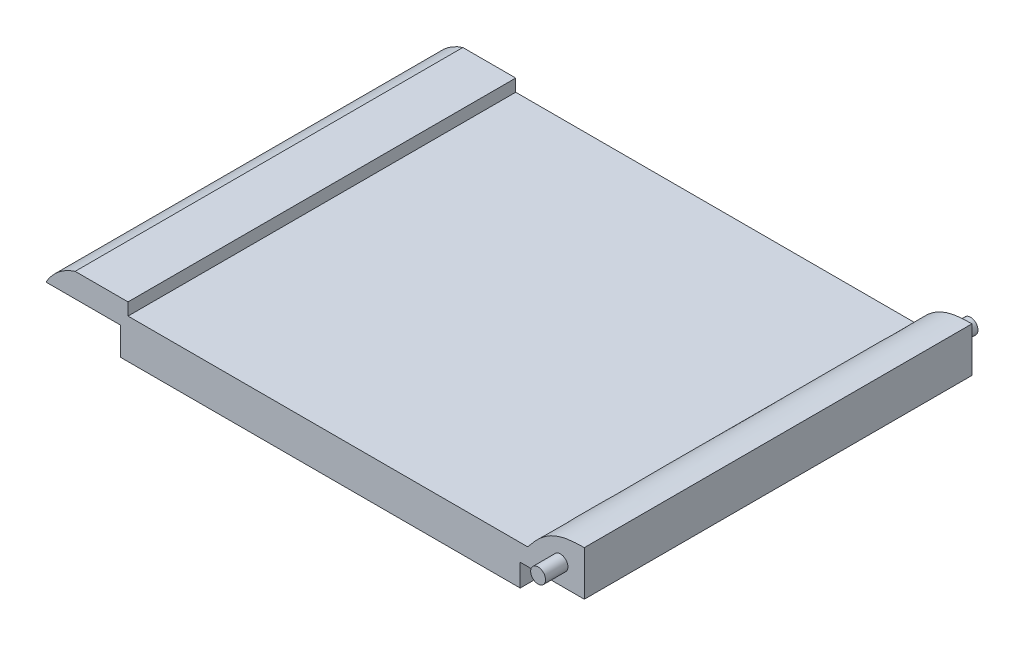
ISO-10303-21;
HEADER;
FILE_DESCRIPTION(('STEP AP214'),'2;1');
FILE_NAME('part.step','',(''),(''),'','','');
FILE_SCHEMA(('AUTOMOTIVE_DESIGN { 1 0 10303 214 1 1 1 1 }'));
ENDSEC;
DATA;
#1=APPLICATION_CONTEXT('core data for automotive mechanical design processes');
#2=APPLICATION_PROTOCOL_DEFINITION('international standard','automotive_design',2000,#1);
#3=PRODUCT_CONTEXT('',#1,'mechanical');
#4=PRODUCT('Part','Part','',(#3));
#5=PRODUCT_RELATED_PRODUCT_CATEGORY('part','',(#4));
#6=PRODUCT_DEFINITION_FORMATION('','',#4);
#7=PRODUCT_DEFINITION_CONTEXT('part definition',#1,'design');
#8=PRODUCT_DEFINITION('design','',#6,#7);
#9=PRODUCT_DEFINITION_SHAPE('','',#8);
#10=(LENGTH_UNIT() NAMED_UNIT(*) SI_UNIT(.MILLI.,.METRE.));
#11=(NAMED_UNIT(*) PLANE_ANGLE_UNIT() SI_UNIT($,.RADIAN.));
#12=(NAMED_UNIT(*) SI_UNIT($,.STERADIAN.) SOLID_ANGLE_UNIT());
#13=UNCERTAINTY_MEASURE_WITH_UNIT(LENGTH_MEASURE(1.E-05),#10,'distance_accuracy_value','');
#14=(GEOMETRIC_REPRESENTATION_CONTEXT(3) GLOBAL_UNCERTAINTY_ASSIGNED_CONTEXT((#13)) GLOBAL_UNIT_ASSIGNED_CONTEXT((#10,
#11,#12)) REPRESENTATION_CONTEXT('',''));
#15=CARTESIAN_POINT('',(0.,0.,0.));
#16=DIRECTION('',(0.,0.,1.));
#17=DIRECTION('',(1.,0.,0.));
#18=AXIS2_PLACEMENT_3D('',#15,#16,#17);
#19=CARTESIAN_POINT('',(-16.8826768324244,1.13116617866198,26.));
#20=DIRECTION('',(1.,0.,0.));
#21=DIRECTION('',(0.,0.,-1.));
#22=AXIS2_PLACEMENT_3D('',#19,#20,#21);
#23=PLANE('',#22);
#24=DIRECTION('',(0.,-1.,0.));
#25=VECTOR('',#24,1.);
#26=CARTESIAN_POINT('',(-16.8826768324244,1.13116617866198,0.));
#27=LINE('',#26,#25);
#28=CARTESIAN_POINT('',(-16.8826768324244,1.13116617866198,0.));
#29=VERTEX_POINT('',#28);
#30=CARTESIAN_POINT('',(-16.8826768324244,-0.738323827774544,0.));
#31=VERTEX_POINT('',#30);
#32=EDGE_CURVE('E162',#29,#31,#27,.T.);
#33=ORIENTED_EDGE('',*,*,#32,.T.);
#34=DIRECTION('',(0.,0.,-1.));
#35=VECTOR('',#34,1.);
#36=CARTESIAN_POINT('',(-16.8826768324244,-0.738323827774544,26.));
#37=LINE('',#36,#35);
#38=CARTESIAN_POINT('',(-16.8826768324244,-0.738323827774544,26.));
#39=VERTEX_POINT('',#38);
#40=EDGE_CURVE('E197',#39,#31,#37,.T.);
#41=ORIENTED_EDGE('',*,*,#40,.F.);
#42=DIRECTION('',(0.,-1.,0.));
#43=VECTOR('',#42,1.);
#44=CARTESIAN_POINT('',(-16.8826768324244,1.13116617866198,26.));
#45=LINE('',#44,#43);
#46=CARTESIAN_POINT('',(-16.8826768324244,1.13116617866198,26.));
#47=VERTEX_POINT('',#46);
#48=EDGE_CURVE('E179',#47,#39,#45,.T.);
#49=ORIENTED_EDGE('',*,*,#48,.F.);
#50=DIRECTION('',(0.,0.,-1.));
#51=VECTOR('',#50,1.);
#52=CARTESIAN_POINT('',(-16.8826768324244,1.13116617866198,26.));
#53=LINE('',#52,#51);
#54=EDGE_CURVE('E158',#47,#29,#53,.T.);
#55=ORIENTED_EDGE('',*,*,#54,.T.);
#56=EDGE_LOOP('',(#33,#41,#49,#55));
#57=FACE_BOUND('',#56,.T.);
#58=ADVANCED_FACE('F42',(#57),#23,.F.);
#59=CARTESIAN_POINT('',(-16.8826768324244,-0.738323827774544,26.));
#60=DIRECTION('',(0.,1.,0.));
#61=DIRECTION('',(0.,0.,1.));
#62=AXIS2_PLACEMENT_3D('',#59,#60,#61);
#63=PLANE('',#62);
#64=DIRECTION('',(1.,0.,0.));
#65=VECTOR('',#64,1.);
#66=CARTESIAN_POINT('',(-16.8826768324244,-0.738323827774544,0.));
#67=LINE('',#66,#65);
#68=CARTESIAN_POINT('',(9.9173231675756,-0.738323827774544,0.));
#69=VERTEX_POINT('',#68);
#70=EDGE_CURVE('E165',#31,#69,#67,.T.);
#71=ORIENTED_EDGE('',*,*,#70,.T.);
#72=DIRECTION('',(0.,0.,-1.));
#73=VECTOR('',#72,1.);
#74=CARTESIAN_POINT('',(9.9173231675756,-0.738323827774544,26.));
#75=LINE('',#74,#73);
#76=CARTESIAN_POINT('',(9.9173231675756,-0.738323827774544,26.));
#77=VERTEX_POINT('',#76);
#78=EDGE_CURVE('E194',#77,#69,#75,.T.);
#79=ORIENTED_EDGE('',*,*,#78,.F.);
#80=DIRECTION('',(1.,0.,0.));
#81=VECTOR('',#80,1.);
#82=CARTESIAN_POINT('',(-16.8826768324244,-0.738323827774544,26.));
#83=LINE('',#82,#81);
#84=EDGE_CURVE('E116',#39,#77,#83,.T.);
#85=ORIENTED_EDGE('',*,*,#84,.F.);
#86=ORIENTED_EDGE('',*,*,#40,.T.);
#87=EDGE_LOOP('',(#71,#79,#85,#86));
#88=FACE_BOUND('',#87,.T.);
#89=ADVANCED_FACE('F353',(#88),#63,.F.);
#90=CARTESIAN_POINT('',(9.9173231675756,-0.738323827774544,26.));
#91=DIRECTION('',(-1.,0.,0.));
#92=DIRECTION('',(0.,0.,1.));
#93=AXIS2_PLACEMENT_3D('',#90,#91,#92);
#94=PLANE('',#93);
#95=DIRECTION('',(0.,1.,0.));
#96=VECTOR('',#95,1.);
#97=CARTESIAN_POINT('',(9.9173231675756,-0.738323827774544,0.));
#98=LINE('',#97,#96);
#99=CARTESIAN_POINT('',(9.9173231675756,0.761676172225456,0.));
#100=VERTEX_POINT('',#99);
#101=EDGE_CURVE('E168',#69,#100,#98,.T.);
#102=ORIENTED_EDGE('',*,*,#101,.T.);
#103=DIRECTION('',(0.,0.,-1.));
#104=VECTOR('',#103,1.);
#105=CARTESIAN_POINT('',(9.9173231675756,0.761676172225456,26.));
#106=LINE('',#105,#104);
#107=CARTESIAN_POINT('',(9.9173231675756,0.761676172225456,26.));
#108=VERTEX_POINT('',#107);
#109=EDGE_CURVE('E190',#108,#100,#106,.T.);
#110=ORIENTED_EDGE('',*,*,#109,.F.);
#111=DIRECTION('',(0.,1.,0.));
#112=VECTOR('',#111,1.);
#113=CARTESIAN_POINT('',(9.9173231675756,-0.738323827774544,26.));
#114=LINE('',#113,#112);
#115=EDGE_CURVE('E334',#77,#108,#114,.T.);
#116=ORIENTED_EDGE('',*,*,#115,.F.);
#117=ORIENTED_EDGE('',*,*,#78,.T.);
#118=EDGE_LOOP('',(#102,#110,#116,#117));
#119=FACE_BOUND('',#118,.T.);
#120=ADVANCED_FACE('F351',(#119),#94,.F.);
#121=CARTESIAN_POINT('',(9.9173231675756,0.761676172225456,26.));
#122=DIRECTION('',(0.,1.,0.));
#123=DIRECTION('',(-1.,0.,0.));
#124=AXIS2_PLACEMENT_3D('',#121,#122,#123);
#125=PLANE('',#124);
#126=DIRECTION('',(1.,0.,0.));
#127=VECTOR('',#126,1.);
#128=CARTESIAN_POINT('',(9.9173231675756,0.761676172225456,0.));
#129=LINE('',#128,#127);
#130=CARTESIAN_POINT('',(14.2173231675756,0.761676172225457,0.));
#131=VERTEX_POINT('',#130);
#132=EDGE_CURVE('E170',#100,#131,#129,.T.);
#133=ORIENTED_EDGE('',*,*,#132,.T.);
#134=DIRECTION('',(0.,0.,-1.));
#135=VECTOR('',#134,1.);
#136=CARTESIAN_POINT('',(14.2173231675756,0.761676172225457,26.));
#137=LINE('',#136,#135);
#138=CARTESIAN_POINT('',(14.2173231675756,0.761676172225457,26.));
#139=VERTEX_POINT('',#138);
#140=EDGE_CURVE('E187',#139,#131,#137,.T.);
#141=ORIENTED_EDGE('',*,*,#140,.F.);
#142=DIRECTION('',(1.,0.,0.));
#143=VECTOR('',#142,1.);
#144=CARTESIAN_POINT('',(9.9173231675756,0.761676172225456,26.));
#145=LINE('',#144,#143);
#146=EDGE_CURVE('E313',#108,#139,#145,.T.);
#147=ORIENTED_EDGE('',*,*,#146,.F.);
#148=ORIENTED_EDGE('',*,*,#109,.T.);
#149=EDGE_LOOP('',(#133,#141,#147,#148));
#150=FACE_BOUND('',#149,.T.);
#151=ADVANCED_FACE('F345',(#150),#125,.F.);
#152=CARTESIAN_POINT('',(14.2173231675756,0.761676172225457,26.));
#153=DIRECTION('',(-1.,0.,0.));
#154=DIRECTION('',(0.,0.,1.));
#155=AXIS2_PLACEMENT_3D('',#152,#153,#154);
#156=PLANE('',#155);
#157=DIRECTION('',(0.,1.,0.));
#158=VECTOR('',#157,1.);
#159=CARTESIAN_POINT('',(14.2173231675756,0.761676172225457,0.));
#160=LINE('',#159,#158);
#161=CARTESIAN_POINT('',(14.2173231675756,3.76167617222546,0.));
#162=VERTEX_POINT('',#161);
#163=EDGE_CURVE('E172',#131,#162,#160,.T.);
#164=ORIENTED_EDGE('',*,*,#163,.T.);
#165=CARTESIAN_POINT('',(14.2173231675756,3.76167617222545,27.3));
#166=CARTESIAN_POINT('',(14.2173231675756,3.76167617222545,17.7666666667059));
#167=CARTESIAN_POINT('',(14.2173231675756,3.76167617222545,8.23333333333334));
#168=CARTESIAN_POINT('',(14.2173231675756,3.76167617222545,-1.29999999999999));
#169=B_SPLINE_CURVE_WITH_KNOTS('',3,(#165,#166,#167,#168),.UNSPECIFIED.,.F.,.F.,(4,4),(-0.0013,
0.0273),.UNSPECIFIED.);
#170=CARTESIAN_POINT('',(14.2173231675756,3.76167617222546,26.));
#171=VERTEX_POINT('',#170);
#172=EDGE_CURVE('E191',#171,#162,#169,.T.);
#173=ORIENTED_EDGE('',*,*,#172,.F.);
#174=DIRECTION('',(0.,1.,0.));
#175=VECTOR('',#174,1.);
#176=CARTESIAN_POINT('',(14.2173231675756,0.761676172225457,26.));
#177=LINE('',#176,#175);
#178=EDGE_CURVE('E309',#139,#171,#177,.T.);
#179=ORIENTED_EDGE('',*,*,#178,.F.);
#180=ORIENTED_EDGE('',*,*,#140,.T.);
#181=EDGE_LOOP('',(#164,#173,#179,#180));
#182=FACE_BOUND('',#181,.T.);
#183=ADVANCED_FACE('F238',(#182),#156,.F.);
#184=CARTESIAN_POINT('',(10.4173231675756,1.90732009596442,26.));
#185=DIRECTION('',(0.,-1.,0.));
#186=DIRECTION('',(1.,0.,0.));
#187=AXIS2_PLACEMENT_3D('',#184,#185,#186);
#188=PLANE('',#187);
#189=DIRECTION('',(-1.,0.,0.));
#190=VECTOR('',#189,1.);
#191=CARTESIAN_POINT('',(10.4173231675756,1.90732009596442,0.));
#192=LINE('',#191,#190);
#193=CARTESIAN_POINT('',(10.4173231675756,1.90732009596442,0.));
#194=VERTEX_POINT('',#193);
#195=CARTESIAN_POINT('',(-16.3826768324244,1.90732009596441,0.));
#196=VERTEX_POINT('',#195);
#197=EDGE_CURVE('E175',#194,#196,#192,.T.);
#198=ORIENTED_EDGE('',*,*,#197,.T.);
#199=DIRECTION('',(0.,0.,-1.));
#200=VECTOR('',#199,1.);
#201=CARTESIAN_POINT('',(-16.3826768324244,1.90732009596441,26.));
#202=LINE('',#201,#200);
#203=CARTESIAN_POINT('',(-16.3826768324244,1.90732009596441,26.));
#204=VERTEX_POINT('',#203);
#205=EDGE_CURVE('E183',#204,#196,#202,.T.);
#206=ORIENTED_EDGE('',*,*,#205,.F.);
#207=DIRECTION('',(-1.,0.,0.));
#208=VECTOR('',#207,1.);
#209=CARTESIAN_POINT('',(10.4173231675756,1.90732009596442,26.));
#210=LINE('',#209,#208);
#211=CARTESIAN_POINT('',(10.4173231675756,1.90732009596442,26.));
#212=VERTEX_POINT('',#211);
#213=EDGE_CURVE('E307',#212,#204,#210,.T.);
#214=ORIENTED_EDGE('',*,*,#213,.F.);
#215=CARTESIAN_POINT('',(10.4173231675756,1.9073200959644,-1.29999999999999));
#216=CARTESIAN_POINT('',(10.4173231675756,1.9073200959644,8.23333333333334));
#217=CARTESIAN_POINT('',(10.4173231675756,1.9073200959644,17.7666666667059));
#218=CARTESIAN_POINT('',(10.4173231675756,1.9073200959644,27.3));
#219=B_SPLINE_CURVE_WITH_KNOTS('',3,(#215,#216,#217,#218),.UNSPECIFIED.,.F.,.F.,(4,4),(-0.0013,
0.0273),.UNSPECIFIED.);
#220=EDGE_CURVE('E186',#212,#194,#219,.F.);
#221=ORIENTED_EDGE('',*,*,#220,.T.);
#222=EDGE_LOOP('',(#198,#206,#214,#221));
#223=FACE_BOUND('',#222,.T.);
#224=ADVANCED_FACE('F233',(#223),#188,.F.);
#225=CARTESIAN_POINT('',(-16.3826768324244,1.90732009596441,26.));
#226=DIRECTION('',(-1.,0.,0.));
#227=DIRECTION('',(0.,0.,1.));
#228=AXIS2_PLACEMENT_3D('',#225,#226,#227);
#229=PLANE('',#228);
#230=DIRECTION('',(0.,1.,0.));
#231=VECTOR('',#230,1.);
#232=CARTESIAN_POINT('',(-16.3826768324244,1.90732009596441,0.));
#233=LINE('',#232,#231);
#234=CARTESIAN_POINT('',(-16.3826768324244,2.73281296324977,0.));
#235=VERTEX_POINT('',#234);
#236=EDGE_CURVE('E173',#196,#235,#233,.T.);
#237=ORIENTED_EDGE('',*,*,#236,.T.);
#238=DIRECTION('',(0.,0.,-1.));
#239=VECTOR('',#238,1.);
#240=CARTESIAN_POINT('',(-16.3826768324244,2.73281296324977,26.));
#241=LINE('',#240,#239);
#242=CARTESIAN_POINT('',(-16.3826768324244,2.73281296324977,26.));
#243=VERTEX_POINT('',#242);
#244=EDGE_CURVE('E153',#243,#235,#241,.T.);
#245=ORIENTED_EDGE('',*,*,#244,.F.);
#246=DIRECTION('',(0.,1.,0.));
#247=VECTOR('',#246,1.);
#248=CARTESIAN_POINT('',(-16.3826768324244,1.90732009596441,26.));
#249=LINE('',#248,#247);
#250=EDGE_CURVE('E144',#204,#243,#249,.T.);
#251=ORIENTED_EDGE('',*,*,#250,.F.);
#252=ORIENTED_EDGE('',*,*,#205,.T.);
#253=EDGE_LOOP('',(#237,#245,#251,#252));
#254=FACE_BOUND('',#253,.T.);
#255=ADVANCED_FACE('F230',(#254),#229,.F.);
#256=CARTESIAN_POINT('',(-16.3826768324244,2.73281296324977,26.));
#257=DIRECTION('',(0.,-1.,0.));
#258=DIRECTION('',(0.,0.,-1.));
#259=AXIS2_PLACEMENT_3D('',#256,#257,#258);
#260=PLANE('',#259);
#261=DIRECTION('',(-1.,0.,0.));
#262=VECTOR('',#261,1.);
#263=CARTESIAN_POINT('',(-16.3826768324244,2.73281296324977,0.));
#264=LINE('',#263,#262);
#265=CARTESIAN_POINT('',(-19.9299380739432,2.73281296324977,0.));
#266=VERTEX_POINT('',#265);
#267=EDGE_CURVE('E152',#235,#266,#264,.T.);
#268=ORIENTED_EDGE('',*,*,#267,.T.);
#269=DIRECTION('',(0.,0.,-1.));
#270=VECTOR('',#269,1.);
#271=CARTESIAN_POINT('',(-19.9299380739432,2.73281296324977,26.));
#272=LINE('',#271,#270);
#273=CARTESIAN_POINT('',(-19.9299380739432,2.73281296324977,26.));
#274=VERTEX_POINT('',#273);
#275=EDGE_CURVE('E149',#274,#266,#272,.T.);
#276=ORIENTED_EDGE('',*,*,#275,.F.);
#277=DIRECTION('',(-1.,0.,0.));
#278=VECTOR('',#277,1.);
#279=CARTESIAN_POINT('',(-16.3826768324244,2.73281296324977,26.));
#280=LINE('',#279,#278);
#281=EDGE_CURVE('E138',#243,#274,#280,.T.);
#282=ORIENTED_EDGE('',*,*,#281,.F.);
#283=ORIENTED_EDGE('',*,*,#244,.T.);
#284=EDGE_LOOP('',(#268,#276,#282,#283));
#285=FACE_BOUND('',#284,.T.);
#286=ADVANCED_FACE('F150',(#285),#260,.F.);
#287=CARTESIAN_POINT('',(-18.921754172857,-0.487591416597911,26.));
#288=DIRECTION('',(0.,0.,-1.));
#289=DIRECTION('',(-1.,0.,0.));
#290=AXIS2_PLACEMENT_3D('',#287,#288,#289);
#291=CYLINDRICAL_SURFACE('',#290,3.3745279889418);
#292=CARTESIAN_POINT('',(-18.921754172857,-0.487591416597911,0.));
#293=DIRECTION('',(0.,0.,1.));
#294=DIRECTION('',(-1.,0.,0.));
#295=AXIS2_PLACEMENT_3D('',#292,#293,#294);
#296=CIRCLE('',#295,3.3745279889418);
#297=CARTESIAN_POINT('',(-21.8826768324244,1.13116617866198,0.));
#298=VERTEX_POINT('',#297);
#299=EDGE_CURVE('E101',#266,#298,#296,.T.);
#300=ORIENTED_EDGE('',*,*,#299,.T.);
#301=DIRECTION('',(0.,0.,-1.));
#302=VECTOR('',#301,1.);
#303=CARTESIAN_POINT('',(-21.8826768324244,1.13116617866198,26.));
#304=LINE('',#303,#302);
#305=CARTESIAN_POINT('',(-21.8826768324244,1.13116617866198,26.));
#306=VERTEX_POINT('',#305);
#307=EDGE_CURVE('E154',#306,#298,#304,.T.);
#308=ORIENTED_EDGE('',*,*,#307,.F.);
#309=CARTESIAN_POINT('',(-18.921754172857,-0.487591416597911,26.));
#310=DIRECTION('',(0.,0.,1.));
#311=DIRECTION('',(-1.,0.,0.));
#312=AXIS2_PLACEMENT_3D('',#309,#310,#311);
#313=CIRCLE('',#312,3.3745279889418);
#314=EDGE_CURVE('E142',#274,#306,#313,.T.);
#315=ORIENTED_EDGE('',*,*,#314,.F.);
#316=ORIENTED_EDGE('',*,*,#275,.T.);
#317=EDGE_LOOP('',(#300,#308,#315,#316));
#318=FACE_BOUND('',#317,.T.);
#319=ADVANCED_FACE('F156',(#318),#291,.T.);
#320=CARTESIAN_POINT('',(-21.8826768324244,1.13116617866198,26.));
#321=DIRECTION('',(0.,1.,0.));
#322=DIRECTION('',(0.,0.,1.));
#323=AXIS2_PLACEMENT_3D('',#320,#321,#322);
#324=PLANE('',#323);
#325=DIRECTION('',(1.,0.,0.));
#326=VECTOR('',#325,1.);
#327=CARTESIAN_POINT('',(-21.8826768324244,1.13116617866198,0.));
#328=LINE('',#327,#326);
#329=EDGE_CURVE('E107',#298,#29,#328,.T.);
#330=ORIENTED_EDGE('',*,*,#329,.T.);
#331=ORIENTED_EDGE('',*,*,#54,.F.);
#332=DIRECTION('',(1.,0.,0.));
#333=VECTOR('',#332,1.);
#334=CARTESIAN_POINT('',(-21.8826768324244,1.13116617866198,26.));
#335=LINE('',#334,#333);
#336=EDGE_CURVE('E63',#306,#47,#335,.T.);
#337=ORIENTED_EDGE('',*,*,#336,.F.);
#338=ORIENTED_EDGE('',*,*,#307,.T.);
#339=EDGE_LOOP('',(#330,#331,#337,#338));
#340=FACE_BOUND('',#339,.T.);
#341=ADVANCED_FACE('F223',(#340),#324,.F.);
#342=CARTESIAN_POINT('',(-18.921754172857,-0.487591416597911,26.));
#343=DIRECTION('',(0.,0.,-1.));
#344=DIRECTION('',(-1.,0.,0.));
#345=AXIS2_PLACEMENT_3D('',#342,#343,#344);
#346=PLANE('',#345);
#347=CARTESIAN_POINT('',(12.6173231675756,2.09167617222546,26.));
#348=DIRECTION('',(0.,0.,-1.));
#349=DIRECTION('',(-1.,0.,0.));
#350=AXIS2_PLACEMENT_3D('',#347,#348,#349);
#351=CIRCLE('',#350,0.499999999999999);
#352=CARTESIAN_POINT('',(12.1173231675756,2.09167617222546,26.));
#353=VERTEX_POINT('',#352);
#354=EDGE_CURVE('E11',#353,#353,#351,.F.);
#355=ORIENTED_EDGE('',*,*,#354,.F.);
#356=EDGE_LOOP('',(#355));
#357=FACE_BOUND('',#356,.T.);
#358=ORIENTED_EDGE('',*,*,#178,.T.);
#359=CARTESIAN_POINT('',(10.4173231675756,1.9073200959644,26.0000000000066));
#360=CARTESIAN_POINT('',(10.6843352214785,2.23735055388623,26.0000000000066));
#361=CARTESIAN_POINT('',(10.9513472753814,2.56738101180805,26.0000000000066));
#362=CARTESIAN_POINT('',(11.6170888547048,3.24733371747333,25.9999999999901));
#363=CARTESIAN_POINT('',(12.4227784428697,3.64050092362964,25.9999999999901));
#364=CARTESIAN_POINT('',(13.3684160398763,3.74688263027699,26.0000000000066));
#365=CARTESIAN_POINT('',(13.7928696037259,3.75427940125122,26.0000000000066));
#366=CARTESIAN_POINT('',(14.2173231675756,3.76167617222545,26.0000000000066));
#367=B_SPLINE_CURVE_WITH_KNOTS('',5,(#359,#360,#361,#362,#363,#364,#365,#366),.UNSPECIFIED.,.F.,
.F.,(6,2,6),(0.,0.5,1.),.UNSPECIFIED.);
#368=EDGE_CURVE('E55',#171,#212,#367,.F.);
#369=ORIENTED_EDGE('',*,*,#368,.T.);
#370=ORIENTED_EDGE('',*,*,#213,.T.);
#371=ORIENTED_EDGE('',*,*,#250,.T.);
#372=ORIENTED_EDGE('',*,*,#281,.T.);
#373=ORIENTED_EDGE('',*,*,#314,.T.);
#374=ORIENTED_EDGE('',*,*,#336,.T.);
#375=ORIENTED_EDGE('',*,*,#48,.T.);
#376=ORIENTED_EDGE('',*,*,#84,.T.);
#377=ORIENTED_EDGE('',*,*,#115,.T.);
#378=ORIENTED_EDGE('',*,*,#146,.T.);
#379=EDGE_LOOP('',(#358,#369,#370,#371,#372,#373,#374,#375,#376,#377,#378));
#380=FACE_BOUND('',#379,.T.);
#381=ADVANCED_FACE('F140',(#357,#380),#346,.F.);
#382=CARTESIAN_POINT('',(-18.921754172857,-0.487591416597911,0.));
#383=DIRECTION('',(0.,0.,-1.));
#384=DIRECTION('',(-1.,0.,0.));
#385=AXIS2_PLACEMENT_3D('',#382,#383,#384);
#386=PLANE('',#385);
#387=CARTESIAN_POINT('',(12.6173231675756,2.09167617222546,0.));
#388=DIRECTION('',(0.,0.,1.));
#389=DIRECTION('',(1.,0.,0.));
#390=AXIS2_PLACEMENT_3D('',#387,#388,#389);
#391=CIRCLE('',#390,0.499999999999999);
#392=CARTESIAN_POINT('',(13.1173231675756,2.09167617222546,0.));
#393=VERTEX_POINT('',#392);
#394=EDGE_CURVE('E549',#393,#393,#391,.T.);
#395=ORIENTED_EDGE('',*,*,#394,.T.);
#396=EDGE_LOOP('',(#395));
#397=FACE_BOUND('',#396,.T.);
#398=ORIENTED_EDGE('',*,*,#197,.F.);
#399=CARTESIAN_POINT('',(14.2173231675756,3.76167617222545,3.1192496502408E-13));
#400=CARTESIAN_POINT('',(13.7928696037259,3.75427940125122,3.12141805458577E-13));
#401=CARTESIAN_POINT('',(13.3684160398763,3.74688263027699,3.12358645893074E-13));
#402=CARTESIAN_POINT('',(12.4227784428697,3.64050092362964,-4.69839011446593E-13));
#403=CARTESIAN_POINT('',(11.6170888547048,3.24733371747333,-4.69839011446593E-13));
#404=CARTESIAN_POINT('',(10.9513472753814,2.56738101180805,3.12358645893074E-13));
#405=CARTESIAN_POINT('',(10.6843352214785,2.23735055388623,3.12141805458577E-13));
#406=CARTESIAN_POINT('',(10.4173231675756,1.9073200959644,3.1192496502408E-13));
#407=B_SPLINE_CURVE_WITH_KNOTS('',5,(#399,#400,#401,#402,#403,#404,#405,#406),.UNSPECIFIED.,.F.,
.F.,(6,2,6),(0.,0.5,1.),.UNSPECIFIED.);
#408=EDGE_CURVE('E199',#194,#162,#407,.F.);
#409=ORIENTED_EDGE('',*,*,#408,.T.);
#410=ORIENTED_EDGE('',*,*,#163,.F.);
#411=ORIENTED_EDGE('',*,*,#132,.F.);
#412=ORIENTED_EDGE('',*,*,#101,.F.);
#413=ORIENTED_EDGE('',*,*,#70,.F.);
#414=ORIENTED_EDGE('',*,*,#32,.F.);
#415=ORIENTED_EDGE('',*,*,#329,.F.);
#416=ORIENTED_EDGE('',*,*,#299,.F.);
#417=ORIENTED_EDGE('',*,*,#267,.F.);
#418=ORIENTED_EDGE('',*,*,#236,.F.);
#419=EDGE_LOOP('',(#398,#409,#410,#411,#412,#413,#414,#415,#416,#417,#418));
#420=FACE_BOUND('',#419,.T.);
#421=ADVANCED_FACE('F210',(#397,#420),#386,.T.);
#422=CARTESIAN_POINT('',(10.4173231675756,1.9073200959644,27.3));
#423=CARTESIAN_POINT('',(10.4173231675756,1.9073200959644,17.7666666667059));
#424=CARTESIAN_POINT('',(10.4173231675756,1.9073200959644,8.23333333333334));
#425=CARTESIAN_POINT('',(10.4173231675756,1.9073200959644,-1.29999999999999));
#426=CARTESIAN_POINT('',(10.6843352214785,2.23735055388623,27.3));
#427=CARTESIAN_POINT('',(10.6843352214785,2.23735055388623,17.7666666667059));
#428=CARTESIAN_POINT('',(10.6843352214785,2.23735055388623,8.23333333333334));
#429=CARTESIAN_POINT('',(10.6843352214785,2.23735055388623,-1.29999999999999));
#430=CARTESIAN_POINT('',(10.9513472753814,2.56738101180805,27.3));
#431=CARTESIAN_POINT('',(10.9513472753814,2.56738101180805,17.7666666667059));
#432=CARTESIAN_POINT('',(10.9513472753814,2.56738101180805,8.23333333333334));
#433=CARTESIAN_POINT('',(10.9513472753814,2.56738101180805,-1.29999999999999));
#434=CARTESIAN_POINT('',(11.6170888547048,3.24733371747333,27.3));
#435=CARTESIAN_POINT('',(11.6170888547048,3.24733371747333,17.7666666665736));
#436=CARTESIAN_POINT('',(11.6170888547048,3.24733371747333,8.23333333333334));
#437=CARTESIAN_POINT('',(11.6170888547048,3.24733371747333,-1.29999999999999));
#438=CARTESIAN_POINT('',(12.4227784428697,3.64050092362964,27.3));
#439=CARTESIAN_POINT('',(12.4227784428697,3.64050092362965,17.7666666665736));
#440=CARTESIAN_POINT('',(12.4227784428697,3.64050092362964,8.23333333333334));
#441=CARTESIAN_POINT('',(12.4227784428697,3.64050092362964,-1.29999999999999));
#442=CARTESIAN_POINT('',(13.3684160398763,3.74688263027699,27.3));
#443=CARTESIAN_POINT('',(13.3684160398763,3.74688263027699,17.7666666667059));
#444=CARTESIAN_POINT('',(13.3684160398763,3.74688263027699,8.23333333333334));
#445=CARTESIAN_POINT('',(13.3684160398763,3.74688263027699,-1.29999999999999));
#446=CARTESIAN_POINT('',(13.7928696037259,3.75427940125122,27.3));
#447=CARTESIAN_POINT('',(13.7928696037259,3.75427940125122,17.7666666667059));
#448=CARTESIAN_POINT('',(13.7928696037259,3.75427940125122,8.23333333333334));
#449=CARTESIAN_POINT('',(13.7928696037259,3.75427940125122,-1.29999999999999));
#450=CARTESIAN_POINT('',(14.2173231675756,3.76167617222545,27.3));
#451=CARTESIAN_POINT('',(14.2173231675756,3.76167617222545,17.7666666667059));
#452=CARTESIAN_POINT('',(14.2173231675756,3.76167617222545,8.23333333333334));
#453=CARTESIAN_POINT('',(14.2173231675756,3.76167617222545,-1.29999999999999));
#454=B_SPLINE_SURFACE_WITH_KNOTS('',5,3,((#422,#423,#424,#425),(#426,#427,#428,#429),(#430,#431,
#432,#433),(#434,#435,#436,#437),(#438,#439,#440,#441),(#442,#443,#444,#445),(#446,#447,#448,
#449),(#450,#451,#452,#453)),.UNSPECIFIED.,.F.,.F.,.F.,(6,2,6),(4,4),(0.,0.5,1.),(-0.0013,
0.0273),.UNSPECIFIED.);
#455=ORIENTED_EDGE('',*,*,#368,.F.);
#456=ORIENTED_EDGE('',*,*,#172,.T.);
#457=ORIENTED_EDGE('',*,*,#408,.F.);
#458=ORIENTED_EDGE('',*,*,#220,.F.);
#459=EDGE_LOOP('',(#455,#456,#457,#458));
#460=FACE_BOUND('',#459,.T.);
#461=ADVANCED_FACE('F45',(#460),#454,.T.);
#462=CARTESIAN_POINT('',(12.6173231675756,2.09167617222546,27.5));
#463=DIRECTION('',(0.,0.,-1.));
#464=DIRECTION('',(-1.,0.,0.));
#465=AXIS2_PLACEMENT_3D('',#462,#463,#464);
#466=CYLINDRICAL_SURFACE('',#465,0.499999999999999);
#467=CARTESIAN_POINT('',(12.6173231675756,2.09167617222546,27.5));
#468=DIRECTION('',(0.,0.,1.));
#469=DIRECTION('',(1.,0.,0.));
#470=AXIS2_PLACEMENT_3D('',#467,#468,#469);
#471=CIRCLE('',#470,0.499999999999999);
#472=CARTESIAN_POINT('',(13.1173231675756,2.09167617222546,27.5));
#473=VERTEX_POINT('',#472);
#474=EDGE_CURVE('E166',#473,#473,#471,.T.);
#475=ORIENTED_EDGE('',*,*,#474,.F.);
#476=EDGE_LOOP('',(#475));
#477=FACE_BOUND('',#476,.T.);
#478=ORIENTED_EDGE('',*,*,#354,.T.);
#479=EDGE_LOOP('',(#478));
#480=FACE_BOUND('',#479,.T.);
#481=ADVANCED_FACE('F429',(#477,#480),#466,.T.);
#482=CARTESIAN_POINT('',(12.6173231675756,2.09167617222546,27.5));
#483=DIRECTION('',(0.,0.,1.));
#484=DIRECTION('',(1.,0.,0.));
#485=AXIS2_PLACEMENT_3D('',#482,#483,#484);
#486=PLANE('',#485);
#487=ORIENTED_EDGE('',*,*,#474,.T.);
#488=EDGE_LOOP('',(#487));
#489=FACE_BOUND('',#488,.T.);
#490=ADVANCED_FACE('F436',(#489),#486,.T.);
#491=CARTESIAN_POINT('',(12.6173231675756,2.09167617222546,0.));
#492=DIRECTION('',(0.,0.,-1.));
#493=DIRECTION('',(-1.,0.,0.));
#494=AXIS2_PLACEMENT_3D('',#491,#492,#493);
#495=CYLINDRICAL_SURFACE('',#494,0.499999999999999);
#496=ORIENTED_EDGE('',*,*,#394,.F.);
#497=EDGE_LOOP('',(#496));
#498=FACE_BOUND('',#497,.T.);
#499=CARTESIAN_POINT('',(12.6173231675756,2.09167617222546,-1.5));
#500=DIRECTION('',(0.,0.,1.));
#501=DIRECTION('',(1.,0.,0.));
#502=AXIS2_PLACEMENT_3D('',#499,#500,#501);
#503=CIRCLE('',#502,0.499999999999999);
#504=CARTESIAN_POINT('',(13.1173231675756,2.09167617222546,-1.5));
#505=VERTEX_POINT('',#504);
#506=EDGE_CURVE('E547',#505,#505,#503,.T.);
#507=ORIENTED_EDGE('',*,*,#506,.T.);
#508=EDGE_LOOP('',(#507));
#509=FACE_BOUND('',#508,.T.);
#510=ADVANCED_FACE('F444',(#498,#509),#495,.T.);
#511=CARTESIAN_POINT('',(12.6173231675756,2.09167617222546,-1.5));
#512=DIRECTION('',(0.,0.,1.));
#513=DIRECTION('',(1.,0.,0.));
#514=AXIS2_PLACEMENT_3D('',#511,#512,#513);
#515=PLANE('',#514);
#516=ORIENTED_EDGE('',*,*,#506,.F.);
#517=EDGE_LOOP('',(#516));
#518=FACE_BOUND('',#517,.T.);
#519=ADVANCED_FACE('F453',(#518),#515,.F.);
#520=CLOSED_SHELL('',(#58,#89,#120,#151,#183,#224,#255,#286,#319,#341,#381,#421,#461,#481,#490,
#510,#519));
#521=MANIFOLD_SOLID_BREP('B2',#520);
#522=ADVANCED_BREP_SHAPE_REPRESENTATION('',(#18,#521),#14);
#523=SHAPE_DEFINITION_REPRESENTATION(#9,#522);
ENDSEC;
END-ISO-10303-21;
